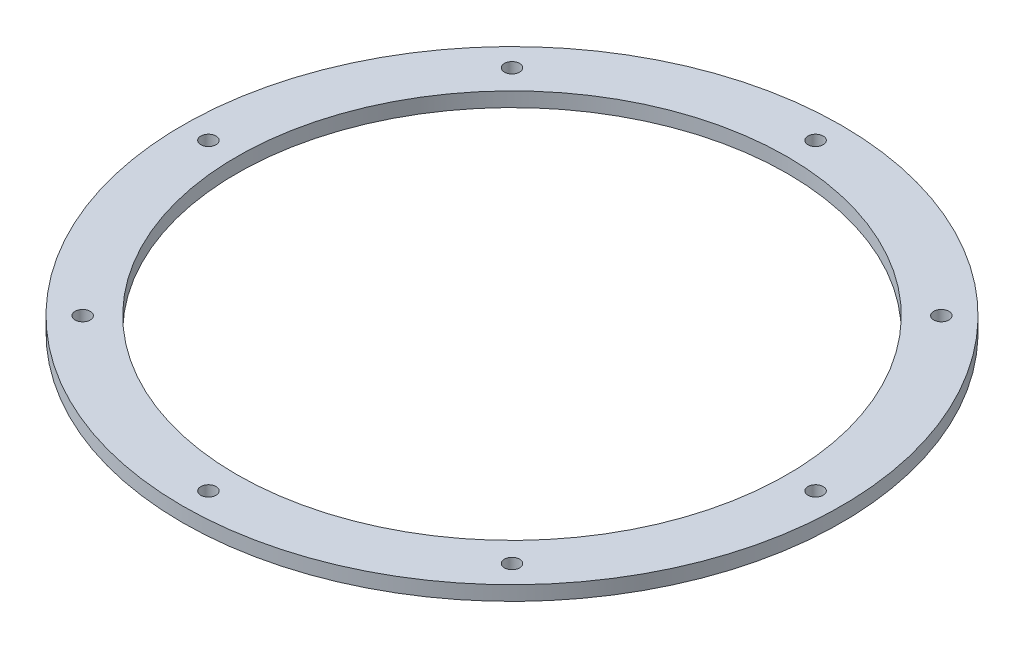
ISO-10303-21;
HEADER;
FILE_DESCRIPTION(('STEP AP214'),'2;1');
FILE_NAME('part.step','',(''),(''),'','','');
FILE_SCHEMA(('AUTOMOTIVE_DESIGN { 1 0 10303 214 1 1 1 1 }'));
ENDSEC;
DATA;
#1=APPLICATION_CONTEXT('core data for automotive mechanical design processes');
#2=APPLICATION_PROTOCOL_DEFINITION('international standard','automotive_design',2000,#1);
#3=PRODUCT_CONTEXT('',#1,'mechanical');
#4=PRODUCT('Part','Part','',(#3));
#5=PRODUCT_RELATED_PRODUCT_CATEGORY('part','',(#4));
#6=PRODUCT_DEFINITION_FORMATION('','',#4);
#7=PRODUCT_DEFINITION_CONTEXT('part definition',#1,'design');
#8=PRODUCT_DEFINITION('design','',#6,#7);
#9=PRODUCT_DEFINITION_SHAPE('','',#8);
#10=(LENGTH_UNIT() NAMED_UNIT(*) SI_UNIT(.MILLI.,.METRE.));
#11=(NAMED_UNIT(*) PLANE_ANGLE_UNIT() SI_UNIT($,.RADIAN.));
#12=(NAMED_UNIT(*) SI_UNIT($,.STERADIAN.) SOLID_ANGLE_UNIT());
#13=UNCERTAINTY_MEASURE_WITH_UNIT(LENGTH_MEASURE(1.E-05),#10,'distance_accuracy_value','');
#14=(GEOMETRIC_REPRESENTATION_CONTEXT(3) GLOBAL_UNCERTAINTY_ASSIGNED_CONTEXT((#13)) GLOBAL_UNIT_ASSIGNED_CONTEXT((#10,
#11,#12)) REPRESENTATION_CONTEXT('',''));
#15=CARTESIAN_POINT('',(0.,0.,0.));
#16=DIRECTION('',(0.,0.,1.));
#17=DIRECTION('',(1.,0.,0.));
#18=AXIS2_PLACEMENT_3D('',#15,#16,#17);
#19=CARTESIAN_POINT('',(0.,0.,0.));
#20=DIRECTION('',(0.,-1.,0.));
#21=DIRECTION('',(0.,0.,-1.));
#22=AXIS2_PLACEMENT_3D('',#19,#20,#21);
#23=CYLINDRICAL_SURFACE('',#22,76.08);
#24=CARTESIAN_POINT('',(0.,15.9049813432836,0.));
#25=DIRECTION('',(0.,-1.,0.));
#26=DIRECTION('',(0.,0.,-1.));
#27=AXIS2_PLACEMENT_3D('',#24,#25,#26);
#28=CIRCLE('',#27,76.08);
#29=CARTESIAN_POINT('',(0.,15.9049813432836,-76.08));
#30=VERTEX_POINT('',#29);
#31=EDGE_CURVE('E78',#30,#30,#28,.T.);
#32=ORIENTED_EDGE('',*,*,#31,.T.);
#33=EDGE_LOOP('',(#32));
#34=FACE_BOUND('',#33,.T.);
#35=CARTESIAN_POINT('',(0.,19.9049813432836,0.));
#36=DIRECTION('',(0.,-1.,0.));
#37=DIRECTION('',(0.,0.,-1.));
#38=AXIS2_PLACEMENT_3D('',#35,#36,#37);
#39=CIRCLE('',#38,76.08);
#40=CARTESIAN_POINT('',(0.,19.9049813432836,-76.08));
#41=VERTEX_POINT('',#40);
#42=EDGE_CURVE('E10',#41,#41,#39,.T.);
#43=ORIENTED_EDGE('',*,*,#42,.F.);
#44=EDGE_LOOP('',(#43));
#45=FACE_BOUND('',#44,.T.);
#46=ADVANCED_FACE('F39',(#34,#45),#23,.F.);
#47=CARTESIAN_POINT('',(76.08,19.9049813432836,0.));
#48=DIRECTION('',(0.,1.,0.));
#49=DIRECTION('',(0.,0.,1.));
#50=AXIS2_PLACEMENT_3D('',#47,#48,#49);
#51=PLANE('',#50);
#52=CARTESIAN_POINT('',(-83.9,19.9049813432836,0.));
#53=DIRECTION('',(0.,1.,0.));
#54=DIRECTION('',(0.,0.,1.));
#55=AXIS2_PLACEMENT_3D('',#52,#53,#54);
#56=CIRCLE('',#55,2.1);
#57=CARTESIAN_POINT('',(-83.9,19.9049813432836,2.1));
#58=VERTEX_POINT('',#57);
#59=EDGE_CURVE('E59',#58,#58,#56,.T.);
#60=ORIENTED_EDGE('',*,*,#59,.F.);
#61=EDGE_LOOP('',(#60));
#62=FACE_BOUND('',#61,.T.);
#63=CARTESIAN_POINT('',(-59.3262589415514,19.9049813432836,-59.3262589415514));
#64=DIRECTION('',(0.,1.,0.));
#65=DIRECTION('',(0.,0.,1.));
#66=AXIS2_PLACEMENT_3D('',#63,#64,#65);
#67=CIRCLE('',#66,2.1);
#68=CARTESIAN_POINT('',(-59.3262589415514,19.9049813432836,-57.2262589415514));
#69=VERTEX_POINT('',#68);
#70=EDGE_CURVE('E105',#69,#69,#67,.T.);
#71=ORIENTED_EDGE('',*,*,#70,.F.);
#72=EDGE_LOOP('',(#71));
#73=FACE_BOUND('',#72,.T.);
#74=CARTESIAN_POINT('',(0.,19.9049813432836,-83.9));
#75=DIRECTION('',(0.,1.,0.));
#76=DIRECTION('',(0.,0.,1.));
#77=AXIS2_PLACEMENT_3D('',#74,#75,#76);
#78=CIRCLE('',#77,2.1);
#79=CARTESIAN_POINT('',(0.,19.9049813432836,-81.8));
#80=VERTEX_POINT('',#79);
#81=EDGE_CURVE('E102',#80,#80,#78,.T.);
#82=ORIENTED_EDGE('',*,*,#81,.F.);
#83=EDGE_LOOP('',(#82));
#84=FACE_BOUND('',#83,.T.);
#85=CARTESIAN_POINT('',(59.3262589415513,19.9049813432836,-59.3262589415514));
#86=DIRECTION('',(0.,1.,0.));
#87=DIRECTION('',(0.,0.,1.));
#88=AXIS2_PLACEMENT_3D('',#85,#86,#87);
#89=CIRCLE('',#88,2.1);
#90=CARTESIAN_POINT('',(59.3262589415513,19.9049813432836,-57.2262589415514));
#91=VERTEX_POINT('',#90);
#92=EDGE_CURVE('E99',#91,#91,#89,.T.);
#93=ORIENTED_EDGE('',*,*,#92,.F.);
#94=EDGE_LOOP('',(#93));
#95=FACE_BOUND('',#94,.T.);
#96=CARTESIAN_POINT('',(83.9,19.9049813432836,0.));
#97=DIRECTION('',(0.,1.,0.));
#98=DIRECTION('',(0.,0.,1.));
#99=AXIS2_PLACEMENT_3D('',#96,#97,#98);
#100=CIRCLE('',#99,2.1);
#101=CARTESIAN_POINT('',(83.9,19.9049813432836,2.09999999999999));
#102=VERTEX_POINT('',#101);
#103=EDGE_CURVE('E96',#102,#102,#100,.T.);
#104=ORIENTED_EDGE('',*,*,#103,.F.);
#105=EDGE_LOOP('',(#104));
#106=FACE_BOUND('',#105,.T.);
#107=CARTESIAN_POINT('',(59.3262589415514,19.9049813432836,59.3262589415514));
#108=DIRECTION('',(0.,1.,0.));
#109=DIRECTION('',(0.,0.,1.));
#110=AXIS2_PLACEMENT_3D('',#107,#108,#109);
#111=CIRCLE('',#110,2.1);
#112=CARTESIAN_POINT('',(59.3262589415514,19.9049813432836,61.4262589415514));
#113=VERTEX_POINT('',#112);
#114=EDGE_CURVE('E93',#113,#113,#111,.T.);
#115=ORIENTED_EDGE('',*,*,#114,.F.);
#116=EDGE_LOOP('',(#115));
#117=FACE_BOUND('',#116,.T.);
#118=CARTESIAN_POINT('',(0.,19.9049813432836,83.9));
#119=DIRECTION('',(0.,1.,0.));
#120=DIRECTION('',(0.,0.,1.));
#121=AXIS2_PLACEMENT_3D('',#118,#119,#120);
#122=CIRCLE('',#121,2.1);
#123=CARTESIAN_POINT('',(0.,19.9049813432836,86.));
#124=VERTEX_POINT('',#123);
#125=EDGE_CURVE('E90',#124,#124,#122,.T.);
#126=ORIENTED_EDGE('',*,*,#125,.F.);
#127=EDGE_LOOP('',(#126));
#128=FACE_BOUND('',#127,.T.);
#129=CARTESIAN_POINT('',(-59.3262589415514,19.9049813432836,59.3262589415513));
#130=DIRECTION('',(0.,1.,0.));
#131=DIRECTION('',(0.,0.,1.));
#132=AXIS2_PLACEMENT_3D('',#129,#130,#131);
#133=CIRCLE('',#132,2.1);
#134=CARTESIAN_POINT('',(-59.3262589415514,19.9049813432836,61.4262589415513));
#135=VERTEX_POINT('',#134);
#136=EDGE_CURVE('E87',#135,#135,#133,.T.);
#137=ORIENTED_EDGE('',*,*,#136,.F.);
#138=EDGE_LOOP('',(#137));
#139=FACE_BOUND('',#138,.T.);
#140=ORIENTED_EDGE('',*,*,#42,.T.);
#141=EDGE_LOOP('',(#140));
#142=FACE_BOUND('',#141,.T.);
#143=CARTESIAN_POINT('',(0.,19.9049813432836,0.));
#144=DIRECTION('',(0.,-1.,0.));
#145=DIRECTION('',(0.,0.,-1.));
#146=AXIS2_PLACEMENT_3D('',#143,#144,#145);
#147=CIRCLE('',#146,91.08);
#148=CARTESIAN_POINT('',(0.,19.9049813432836,-91.08));
#149=VERTEX_POINT('',#148);
#150=EDGE_CURVE('E46',#149,#149,#147,.T.);
#151=ORIENTED_EDGE('',*,*,#150,.F.);
#152=EDGE_LOOP('',(#151));
#153=FACE_BOUND('',#152,.T.);
#154=ADVANCED_FACE('F113',(#62,#73,#84,#95,#106,#117,#128,#139,#142,#153),#51,.T.);
#155=CARTESIAN_POINT('',(0.,0.,0.));
#156=DIRECTION('',(0.,-1.,0.));
#157=DIRECTION('',(0.,0.,-1.));
#158=AXIS2_PLACEMENT_3D('',#155,#156,#157);
#159=CYLINDRICAL_SURFACE('',#158,91.08);
#160=ORIENTED_EDGE('',*,*,#150,.T.);
#161=EDGE_LOOP('',(#160));
#162=FACE_BOUND('',#161,.T.);
#163=CARTESIAN_POINT('',(0.,15.9049813432836,0.));
#164=DIRECTION('',(0.,-1.,0.));
#165=DIRECTION('',(0.,0.,-1.));
#166=AXIS2_PLACEMENT_3D('',#163,#164,#165);
#167=CIRCLE('',#166,91.08);
#168=CARTESIAN_POINT('',(0.,15.9049813432836,-91.08));
#169=VERTEX_POINT('',#168);
#170=EDGE_CURVE('E51',#169,#169,#167,.T.);
#171=ORIENTED_EDGE('',*,*,#170,.F.);
#172=EDGE_LOOP('',(#171));
#173=FACE_BOUND('',#172,.T.);
#174=ADVANCED_FACE('F116',(#162,#173),#159,.T.);
#175=CARTESIAN_POINT('',(76.08,15.9049813432836,0.));
#176=DIRECTION('',(0.,-1.,0.));
#177=DIRECTION('',(0.,0.,-1.));
#178=AXIS2_PLACEMENT_3D('',#175,#176,#177);
#179=PLANE('',#178);
#180=CARTESIAN_POINT('',(-83.9,15.9049813432836,0.));
#181=DIRECTION('',(0.,-1.,0.));
#182=DIRECTION('',(0.,0.,-1.));
#183=AXIS2_PLACEMENT_3D('',#180,#181,#182);
#184=CIRCLE('',#183,2.1);
#185=CARTESIAN_POINT('',(-83.9,15.9049813432836,-2.1));
#186=VERTEX_POINT('',#185);
#187=EDGE_CURVE('E42',#186,#186,#184,.T.);
#188=ORIENTED_EDGE('',*,*,#187,.F.);
#189=EDGE_LOOP('',(#188));
#190=FACE_BOUND('',#189,.T.);
#191=CARTESIAN_POINT('',(-59.3262589415514,15.9049813432836,-59.3262589415514));
#192=DIRECTION('',(0.,-1.,0.));
#193=DIRECTION('',(0.,0.,-1.));
#194=AXIS2_PLACEMENT_3D('',#191,#192,#193);
#195=CIRCLE('',#194,2.1);
#196=CARTESIAN_POINT('',(-59.3262589415514,15.9049813432836,-61.4262589415513));
#197=VERTEX_POINT('',#196);
#198=EDGE_CURVE('E73',#197,#197,#195,.T.);
#199=ORIENTED_EDGE('',*,*,#198,.F.);
#200=EDGE_LOOP('',(#199));
#201=FACE_BOUND('',#200,.T.);
#202=CARTESIAN_POINT('',(0.,15.9049813432836,-83.9));
#203=DIRECTION('',(0.,-1.,0.));
#204=DIRECTION('',(0.,0.,-1.));
#205=AXIS2_PLACEMENT_3D('',#202,#203,#204);
#206=CIRCLE('',#205,2.1);
#207=CARTESIAN_POINT('',(0.,15.9049813432836,-86.));
#208=VERTEX_POINT('',#207);
#209=EDGE_CURVE('E71',#208,#208,#206,.T.);
#210=ORIENTED_EDGE('',*,*,#209,.F.);
#211=EDGE_LOOP('',(#210));
#212=FACE_BOUND('',#211,.T.);
#213=CARTESIAN_POINT('',(59.3262589415513,15.9049813432836,-59.3262589415514));
#214=DIRECTION('',(0.,-1.,0.));
#215=DIRECTION('',(0.,0.,-1.));
#216=AXIS2_PLACEMENT_3D('',#213,#214,#215);
#217=CIRCLE('',#216,2.1);
#218=CARTESIAN_POINT('',(59.3262589415513,15.9049813432836,-61.4262589415513));
#219=VERTEX_POINT('',#218);
#220=EDGE_CURVE('E68',#219,#219,#217,.T.);
#221=ORIENTED_EDGE('',*,*,#220,.F.);
#222=EDGE_LOOP('',(#221));
#223=FACE_BOUND('',#222,.T.);
#224=CARTESIAN_POINT('',(83.9,15.9049813432836,0.));
#225=DIRECTION('',(0.,-1.,0.));
#226=DIRECTION('',(0.,0.,-1.));
#227=AXIS2_PLACEMENT_3D('',#224,#225,#226);
#228=CIRCLE('',#227,2.1);
#229=CARTESIAN_POINT('',(83.9,15.9049813432836,-2.10000000000002));
#230=VERTEX_POINT('',#229);
#231=EDGE_CURVE('E65',#230,#230,#228,.T.);
#232=ORIENTED_EDGE('',*,*,#231,.F.);
#233=EDGE_LOOP('',(#232));
#234=FACE_BOUND('',#233,.T.);
#235=CARTESIAN_POINT('',(59.3262589415514,15.9049813432836,59.3262589415514));
#236=DIRECTION('',(0.,-1.,0.));
#237=DIRECTION('',(0.,0.,-1.));
#238=AXIS2_PLACEMENT_3D('',#235,#236,#237);
#239=CIRCLE('',#238,2.1);
#240=CARTESIAN_POINT('',(59.3262589415514,15.9049813432836,57.2262589415514));
#241=VERTEX_POINT('',#240);
#242=EDGE_CURVE('E62',#241,#241,#239,.T.);
#243=ORIENTED_EDGE('',*,*,#242,.F.);
#244=EDGE_LOOP('',(#243));
#245=FACE_BOUND('',#244,.T.);
#246=CARTESIAN_POINT('',(0.,15.9049813432836,83.9));
#247=DIRECTION('',(0.,-1.,0.));
#248=DIRECTION('',(0.,0.,-1.));
#249=AXIS2_PLACEMENT_3D('',#246,#247,#248);
#250=CIRCLE('',#249,2.1);
#251=CARTESIAN_POINT('',(0.,15.9049813432836,81.8));
#252=VERTEX_POINT('',#251);
#253=EDGE_CURVE('E58',#252,#252,#250,.T.);
#254=ORIENTED_EDGE('',*,*,#253,.F.);
#255=EDGE_LOOP('',(#254));
#256=FACE_BOUND('',#255,.T.);
#257=CARTESIAN_POINT('',(-59.3262589415514,15.9049813432836,59.3262589415513));
#258=DIRECTION('',(0.,-1.,0.));
#259=DIRECTION('',(0.,0.,-1.));
#260=AXIS2_PLACEMENT_3D('',#257,#258,#259);
#261=CIRCLE('',#260,2.1);
#262=CARTESIAN_POINT('',(-59.3262589415514,15.9049813432836,57.2262589415513));
#263=VERTEX_POINT('',#262);
#264=EDGE_CURVE('E55',#263,#263,#261,.T.);
#265=ORIENTED_EDGE('',*,*,#264,.F.);
#266=EDGE_LOOP('',(#265));
#267=FACE_BOUND('',#266,.T.);
#268=ORIENTED_EDGE('',*,*,#170,.T.);
#269=EDGE_LOOP('',(#268));
#270=FACE_BOUND('',#269,.T.);
#271=ORIENTED_EDGE('',*,*,#31,.F.);
#272=EDGE_LOOP('',(#271));
#273=FACE_BOUND('',#272,.T.);
#274=ADVANCED_FACE('F135',(#190,#201,#212,#223,#234,#245,#256,#267,#270,#273),#179,.T.);
#275=CARTESIAN_POINT('',(-59.3262589415514,9.90498134328358,59.3262589415513));
#276=DIRECTION('',(0.,1.,0.));
#277=DIRECTION('',(0.,0.,1.));
#278=AXIS2_PLACEMENT_3D('',#275,#276,#277);
#279=CYLINDRICAL_SURFACE('',#278,2.1);
#280=ORIENTED_EDGE('',*,*,#264,.T.);
#281=EDGE_LOOP('',(#280));
#282=FACE_BOUND('',#281,.T.);
#283=ORIENTED_EDGE('',*,*,#136,.T.);
#284=EDGE_LOOP('',(#283));
#285=FACE_BOUND('',#284,.T.);
#286=ADVANCED_FACE('F141',(#282,#285),#279,.F.);
#287=CARTESIAN_POINT('',(0.,9.90498134328358,83.9));
#288=DIRECTION('',(0.,1.,0.));
#289=DIRECTION('',(0.,0.,1.));
#290=AXIS2_PLACEMENT_3D('',#287,#288,#289);
#291=CYLINDRICAL_SURFACE('',#290,2.1);
#292=ORIENTED_EDGE('',*,*,#253,.T.);
#293=EDGE_LOOP('',(#292));
#294=FACE_BOUND('',#293,.T.);
#295=ORIENTED_EDGE('',*,*,#125,.T.);
#296=EDGE_LOOP('',(#295));
#297=FACE_BOUND('',#296,.T.);
#298=ADVANCED_FACE('F147',(#294,#297),#291,.F.);
#299=CARTESIAN_POINT('',(59.3262589415514,9.90498134328358,59.3262589415514));
#300=DIRECTION('',(0.,1.,0.));
#301=DIRECTION('',(0.,0.,1.));
#302=AXIS2_PLACEMENT_3D('',#299,#300,#301);
#303=CYLINDRICAL_SURFACE('',#302,2.1);
#304=ORIENTED_EDGE('',*,*,#242,.T.);
#305=EDGE_LOOP('',(#304));
#306=FACE_BOUND('',#305,.T.);
#307=ORIENTED_EDGE('',*,*,#114,.T.);
#308=EDGE_LOOP('',(#307));
#309=FACE_BOUND('',#308,.T.);
#310=ADVANCED_FACE('F185',(#306,#309),#303,.F.);
#311=CARTESIAN_POINT('',(83.9,9.90498134328358,0.));
#312=DIRECTION('',(0.,1.,0.));
#313=DIRECTION('',(0.,0.,1.));
#314=AXIS2_PLACEMENT_3D('',#311,#312,#313);
#315=CYLINDRICAL_SURFACE('',#314,2.1);
#316=ORIENTED_EDGE('',*,*,#231,.T.);
#317=EDGE_LOOP('',(#316));
#318=FACE_BOUND('',#317,.T.);
#319=ORIENTED_EDGE('',*,*,#103,.T.);
#320=EDGE_LOOP('',(#319));
#321=FACE_BOUND('',#320,.T.);
#322=ADVANCED_FACE('F194',(#318,#321),#315,.F.);
#323=CARTESIAN_POINT('',(59.3262589415513,9.90498134328358,-59.3262589415514));
#324=DIRECTION('',(0.,1.,0.));
#325=DIRECTION('',(0.,0.,1.));
#326=AXIS2_PLACEMENT_3D('',#323,#324,#325);
#327=CYLINDRICAL_SURFACE('',#326,2.1);
#328=ORIENTED_EDGE('',*,*,#220,.T.);
#329=EDGE_LOOP('',(#328));
#330=FACE_BOUND('',#329,.T.);
#331=ORIENTED_EDGE('',*,*,#92,.T.);
#332=EDGE_LOOP('',(#331));
#333=FACE_BOUND('',#332,.T.);
#334=ADVANCED_FACE('F203',(#330,#333),#327,.F.);
#335=CARTESIAN_POINT('',(0.,9.90498134328358,-83.9));
#336=DIRECTION('',(0.,1.,0.));
#337=DIRECTION('',(0.,0.,1.));
#338=AXIS2_PLACEMENT_3D('',#335,#336,#337);
#339=CYLINDRICAL_SURFACE('',#338,2.1);
#340=ORIENTED_EDGE('',*,*,#209,.T.);
#341=EDGE_LOOP('',(#340));
#342=FACE_BOUND('',#341,.T.);
#343=ORIENTED_EDGE('',*,*,#81,.T.);
#344=EDGE_LOOP('',(#343));
#345=FACE_BOUND('',#344,.T.);
#346=ADVANCED_FACE('F212',(#342,#345),#339,.F.);
#347=CARTESIAN_POINT('',(-59.3262589415514,9.90498134328358,-59.3262589415514));
#348=DIRECTION('',(0.,1.,0.));
#349=DIRECTION('',(0.,0.,1.));
#350=AXIS2_PLACEMENT_3D('',#347,#348,#349);
#351=CYLINDRICAL_SURFACE('',#350,2.1);
#352=ORIENTED_EDGE('',*,*,#198,.T.);
#353=EDGE_LOOP('',(#352));
#354=FACE_BOUND('',#353,.T.);
#355=ORIENTED_EDGE('',*,*,#70,.T.);
#356=EDGE_LOOP('',(#355));
#357=FACE_BOUND('',#356,.T.);
#358=ADVANCED_FACE('F221',(#354,#357),#351,.F.);
#359=CARTESIAN_POINT('',(-83.9,9.90498134328358,0.));
#360=DIRECTION('',(0.,1.,0.));
#361=DIRECTION('',(0.,0.,1.));
#362=AXIS2_PLACEMENT_3D('',#359,#360,#361);
#363=CYLINDRICAL_SURFACE('',#362,2.1);
#364=ORIENTED_EDGE('',*,*,#187,.T.);
#365=EDGE_LOOP('',(#364));
#366=FACE_BOUND('',#365,.T.);
#367=ORIENTED_EDGE('',*,*,#59,.T.);
#368=EDGE_LOOP('',(#367));
#369=FACE_BOUND('',#368,.T.);
#370=ADVANCED_FACE('F111',(#366,#369),#363,.F.);
#371=CLOSED_SHELL('',(#46,#154,#174,#274,#286,#298,#310,#322,#334,#346,#358,#370));
#372=MANIFOLD_SOLID_BREP('B2',#371);
#373=ADVANCED_BREP_SHAPE_REPRESENTATION('',(#18,#372),#14);
#374=SHAPE_DEFINITION_REPRESENTATION(#9,#373);
ENDSEC;
END-ISO-10303-21;
